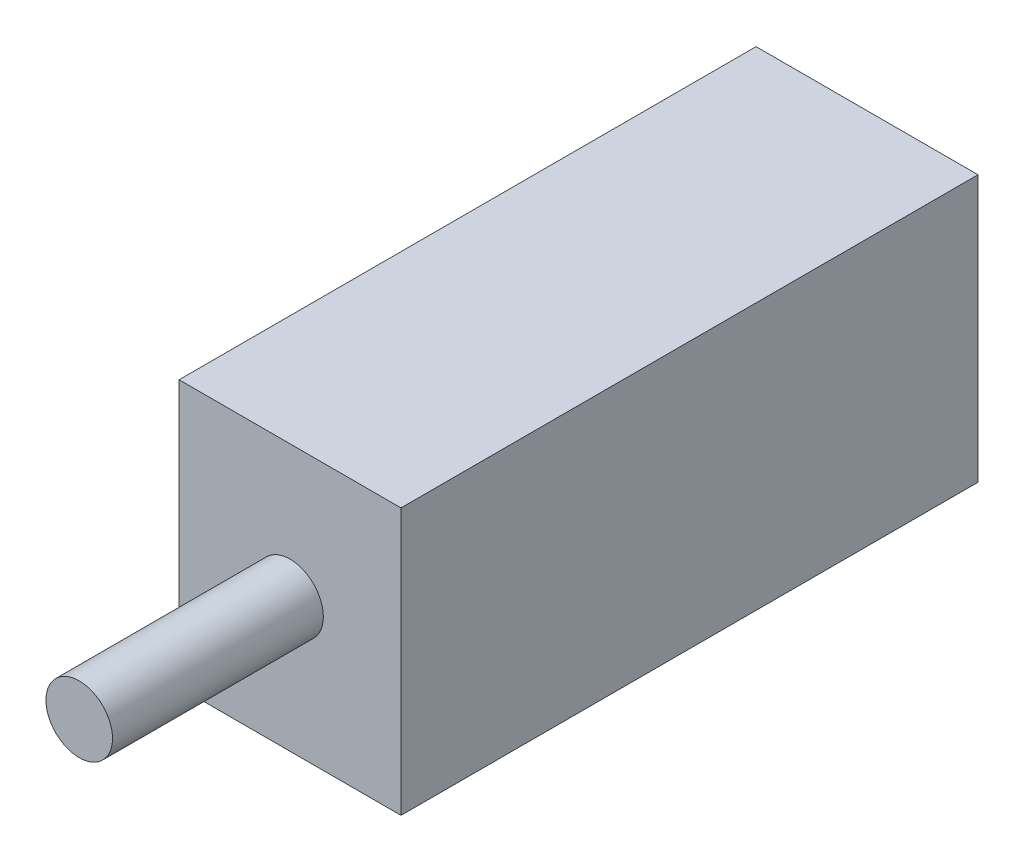
ISO-10303-21;
HEADER;
FILE_DESCRIPTION(('STEP AP214'),'2;1');
FILE_NAME('part.step','',(''),(''),'','','');
FILE_SCHEMA(('AUTOMOTIVE_DESIGN { 1 0 10303 214 1 1 1 1 }'));
ENDSEC;
DATA;
#1=APPLICATION_CONTEXT('core data for automotive mechanical design processes');
#2=APPLICATION_PROTOCOL_DEFINITION('international standard','automotive_design',2000,#1);
#3=PRODUCT_CONTEXT('',#1,'mechanical');
#4=PRODUCT('Part','Part','',(#3));
#5=PRODUCT_RELATED_PRODUCT_CATEGORY('part','',(#4));
#6=PRODUCT_DEFINITION_FORMATION('','',#4);
#7=PRODUCT_DEFINITION_CONTEXT('part definition',#1,'design');
#8=PRODUCT_DEFINITION('design','',#6,#7);
#9=PRODUCT_DEFINITION_SHAPE('','',#8);
#10=(LENGTH_UNIT() NAMED_UNIT(*) SI_UNIT(.MILLI.,.METRE.));
#11=(NAMED_UNIT(*) PLANE_ANGLE_UNIT() SI_UNIT($,.RADIAN.));
#12=(NAMED_UNIT(*) SI_UNIT($,.STERADIAN.) SOLID_ANGLE_UNIT());
#13=UNCERTAINTY_MEASURE_WITH_UNIT(LENGTH_MEASURE(1.E-05),#10,'distance_accuracy_value','');
#14=(GEOMETRIC_REPRESENTATION_CONTEXT(3) GLOBAL_UNCERTAINTY_ASSIGNED_CONTEXT((#13)) GLOBAL_UNIT_ASSIGNED_CONTEXT((#10,
#11,#12)) REPRESENTATION_CONTEXT('',''));
#15=CARTESIAN_POINT('',(0.,0.,0.));
#16=DIRECTION('',(0.,0.,1.));
#17=DIRECTION('',(1.,0.,0.));
#18=AXIS2_PLACEMENT_3D('',#15,#16,#17);
#19=CARTESIAN_POINT('',(0.,0.,26.));
#20=DIRECTION('',(1.,0.,0.));
#21=DIRECTION('',(0.,0.,-1.));
#22=AXIS2_PLACEMENT_3D('',#19,#20,#21);
#23=PLANE('',#22);
#24=DIRECTION('',(0.,-1.,0.));
#25=VECTOR('',#24,1.);
#26=CARTESIAN_POINT('',(0.,0.,0.));
#27=LINE('',#26,#25);
#28=CARTESIAN_POINT('',(0.,12.,0.));
#29=VERTEX_POINT('',#28);
#30=CARTESIAN_POINT('',(0.,0.,0.));
#31=VERTEX_POINT('',#30);
#32=EDGE_CURVE('E99',#29,#31,#27,.T.);
#33=ORIENTED_EDGE('',*,*,#32,.T.);
#34=DIRECTION('',(0.,0.,-1.));
#35=VECTOR('',#34,1.);
#36=CARTESIAN_POINT('',(0.,0.,26.));
#37=LINE('',#36,#35);
#38=CARTESIAN_POINT('',(0.,0.,26.));
#39=VERTEX_POINT('',#38);
#40=EDGE_CURVE('E36',#39,#31,#37,.T.);
#41=ORIENTED_EDGE('',*,*,#40,.F.);
#42=DIRECTION('',(0.,-1.,0.));
#43=VECTOR('',#42,1.);
#44=CARTESIAN_POINT('',(0.,0.,26.));
#45=LINE('',#44,#43);
#46=CARTESIAN_POINT('',(0.,12.,26.));
#47=VERTEX_POINT('',#46);
#48=EDGE_CURVE('E86',#47,#39,#45,.T.);
#49=ORIENTED_EDGE('',*,*,#48,.F.);
#50=DIRECTION('',(0.,0.,-1.));
#51=VECTOR('',#50,1.);
#52=CARTESIAN_POINT('',(0.,12.,26.));
#53=LINE('',#52,#51);
#54=EDGE_CURVE('E95',#47,#29,#53,.T.);
#55=ORIENTED_EDGE('',*,*,#54,.T.);
#56=EDGE_LOOP('',(#33,#41,#49,#55));
#57=FACE_BOUND('',#56,.T.);
#58=ADVANCED_FACE('F33',(#57),#23,.F.);
#59=CARTESIAN_POINT('',(0.,0.,26.));
#60=DIRECTION('',(0.,1.,0.));
#61=DIRECTION('',(0.,0.,1.));
#62=AXIS2_PLACEMENT_3D('',#59,#60,#61);
#63=PLANE('',#62);
#64=DIRECTION('',(1.,0.,0.));
#65=VECTOR('',#64,1.);
#66=CARTESIAN_POINT('',(0.,0.,0.));
#67=LINE('',#66,#65);
#68=CARTESIAN_POINT('',(10.,0.,0.));
#69=VERTEX_POINT('',#68);
#70=EDGE_CURVE('E91',#31,#69,#67,.T.);
#71=ORIENTED_EDGE('',*,*,#70,.T.);
#72=DIRECTION('',(0.,0.,-1.));
#73=VECTOR('',#72,1.);
#74=CARTESIAN_POINT('',(10.,0.,26.));
#75=LINE('',#74,#73);
#76=CARTESIAN_POINT('',(10.,0.,26.));
#77=VERTEX_POINT('',#76);
#78=EDGE_CURVE('E89',#77,#69,#75,.T.);
#79=ORIENTED_EDGE('',*,*,#78,.F.);
#80=DIRECTION('',(1.,0.,0.));
#81=VECTOR('',#80,1.);
#82=CARTESIAN_POINT('',(0.,0.,26.));
#83=LINE('',#82,#81);
#84=EDGE_CURVE('E81',#39,#77,#83,.T.);
#85=ORIENTED_EDGE('',*,*,#84,.F.);
#86=ORIENTED_EDGE('',*,*,#40,.T.);
#87=EDGE_LOOP('',(#71,#79,#85,#86));
#88=FACE_BOUND('',#87,.T.);
#89=ADVANCED_FACE('F90',(#88),#63,.F.);
#90=CARTESIAN_POINT('',(10.,0.,26.));
#91=DIRECTION('',(-1.,0.,0.));
#92=DIRECTION('',(0.,0.,1.));
#93=AXIS2_PLACEMENT_3D('',#90,#91,#92);
#94=PLANE('',#93);
#95=DIRECTION('',(0.,1.,0.));
#96=VECTOR('',#95,1.);
#97=CARTESIAN_POINT('',(10.,0.,0.));
#98=LINE('',#97,#96);
#99=CARTESIAN_POINT('',(10.,12.,0.));
#100=VERTEX_POINT('',#99);
#101=EDGE_CURVE('E67',#69,#100,#98,.T.);
#102=ORIENTED_EDGE('',*,*,#101,.T.);
#103=DIRECTION('',(0.,0.,-1.));
#104=VECTOR('',#103,1.);
#105=CARTESIAN_POINT('',(10.,12.,26.));
#106=LINE('',#105,#104);
#107=CARTESIAN_POINT('',(10.,12.,26.));
#108=VERTEX_POINT('',#107);
#109=EDGE_CURVE('E92',#108,#100,#106,.T.);
#110=ORIENTED_EDGE('',*,*,#109,.F.);
#111=DIRECTION('',(0.,1.,0.));
#112=VECTOR('',#111,1.);
#113=CARTESIAN_POINT('',(10.,0.,26.));
#114=LINE('',#113,#112);
#115=EDGE_CURVE('E84',#77,#108,#114,.T.);
#116=ORIENTED_EDGE('',*,*,#115,.F.);
#117=ORIENTED_EDGE('',*,*,#78,.T.);
#118=EDGE_LOOP('',(#102,#110,#116,#117));
#119=FACE_BOUND('',#118,.T.);
#120=ADVANCED_FACE('F93',(#119),#94,.F.);
#121=CARTESIAN_POINT('',(0.,12.,26.));
#122=DIRECTION('',(0.,-1.,0.));
#123=DIRECTION('',(0.,0.,-1.));
#124=AXIS2_PLACEMENT_3D('',#121,#122,#123);
#125=PLANE('',#124);
#126=DIRECTION('',(-1.,0.,0.));
#127=VECTOR('',#126,1.);
#128=CARTESIAN_POINT('',(0.,12.,0.));
#129=LINE('',#128,#127);
#130=EDGE_CURVE('E73',#100,#29,#129,.T.);
#131=ORIENTED_EDGE('',*,*,#130,.T.);
#132=ORIENTED_EDGE('',*,*,#54,.F.);
#133=DIRECTION('',(-1.,0.,0.));
#134=VECTOR('',#133,1.);
#135=CARTESIAN_POINT('',(0.,12.,26.));
#136=LINE('',#135,#134);
#137=EDGE_CURVE('E50',#108,#47,#136,.T.);
#138=ORIENTED_EDGE('',*,*,#137,.F.);
#139=ORIENTED_EDGE('',*,*,#109,.T.);
#140=EDGE_LOOP('',(#131,#132,#138,#139));
#141=FACE_BOUND('',#140,.T.);
#142=ADVANCED_FACE('F107',(#141),#125,.F.);
#143=CARTESIAN_POINT('',(0.,0.,26.));
#144=DIRECTION('',(0.,0.,-1.));
#145=DIRECTION('',(-1.,0.,0.));
#146=AXIS2_PLACEMENT_3D('',#143,#144,#145);
#147=PLANE('',#146);
#148=CARTESIAN_POINT('',(5.,6.,26.));
#149=DIRECTION('',(0.,0.,1.));
#150=DIRECTION('',(1.,0.,0.));
#151=AXIS2_PLACEMENT_3D('',#148,#149,#150);
#152=CIRCLE('',#151,1.5);
#153=CARTESIAN_POINT('',(6.5,6.,26.));
#154=VERTEX_POINT('',#153);
#155=EDGE_CURVE('E11',#154,#154,#152,.T.);
#156=ORIENTED_EDGE('',*,*,#155,.F.);
#157=EDGE_LOOP('',(#156));
#158=FACE_BOUND('',#157,.T.);
#159=ORIENTED_EDGE('',*,*,#48,.T.);
#160=ORIENTED_EDGE('',*,*,#84,.T.);
#161=ORIENTED_EDGE('',*,*,#115,.T.);
#162=ORIENTED_EDGE('',*,*,#137,.T.);
#163=EDGE_LOOP('',(#159,#160,#161,#162));
#164=FACE_BOUND('',#163,.T.);
#165=ADVANCED_FACE('F82',(#158,#164),#147,.F.);
#166=CARTESIAN_POINT('',(0.,0.,0.));
#167=DIRECTION('',(0.,0.,-1.));
#168=DIRECTION('',(-1.,0.,0.));
#169=AXIS2_PLACEMENT_3D('',#166,#167,#168);
#170=PLANE('',#169);
#171=ORIENTED_EDGE('',*,*,#32,.F.);
#172=ORIENTED_EDGE('',*,*,#130,.F.);
#173=ORIENTED_EDGE('',*,*,#101,.F.);
#174=ORIENTED_EDGE('',*,*,#70,.F.);
#175=EDGE_LOOP('',(#171,#172,#173,#174));
#176=FACE_BOUND('',#175,.T.);
#177=ADVANCED_FACE('F110',(#176),#170,.T.);
#178=CARTESIAN_POINT('',(5.,6.,35.5));
#179=DIRECTION('',(0.,0.,-1.));
#180=DIRECTION('',(-1.,0.,0.));
#181=AXIS2_PLACEMENT_3D('',#178,#179,#180);
#182=CYLINDRICAL_SURFACE('',#181,1.5);
#183=CARTESIAN_POINT('',(5.,6.,35.5));
#184=DIRECTION('',(0.,0.,1.));
#185=DIRECTION('',(1.,0.,0.));
#186=AXIS2_PLACEMENT_3D('',#183,#184,#185);
#187=CIRCLE('',#186,1.5);
#188=CARTESIAN_POINT('',(6.5,6.,35.5));
#189=VERTEX_POINT('',#188);
#190=EDGE_CURVE('E102',#189,#189,#187,.T.);
#191=ORIENTED_EDGE('',*,*,#190,.F.);
#192=EDGE_LOOP('',(#191));
#193=FACE_BOUND('',#192,.T.);
#194=ORIENTED_EDGE('',*,*,#155,.T.);
#195=EDGE_LOOP('',(#194));
#196=FACE_BOUND('',#195,.T.);
#197=ADVANCED_FACE('F118',(#193,#196),#182,.T.);
#198=CARTESIAN_POINT('',(5.,6.,35.5));
#199=DIRECTION('',(0.,0.,1.));
#200=DIRECTION('',(1.,0.,0.));
#201=AXIS2_PLACEMENT_3D('',#198,#199,#200);
#202=PLANE('',#201);
#203=ORIENTED_EDGE('',*,*,#190,.T.);
#204=EDGE_LOOP('',(#203));
#205=FACE_BOUND('',#204,.T.);
#206=ADVANCED_FACE('F116',(#205),#202,.T.);
#207=CLOSED_SHELL('',(#58,#89,#120,#142,#165,#177,#197,#206));
#208=MANIFOLD_SOLID_BREP('B2',#207);
#209=ADVANCED_BREP_SHAPE_REPRESENTATION('',(#18,#208),#14);
#210=SHAPE_DEFINITION_REPRESENTATION(#9,#209);
ENDSEC;
END-ISO-10303-21;
